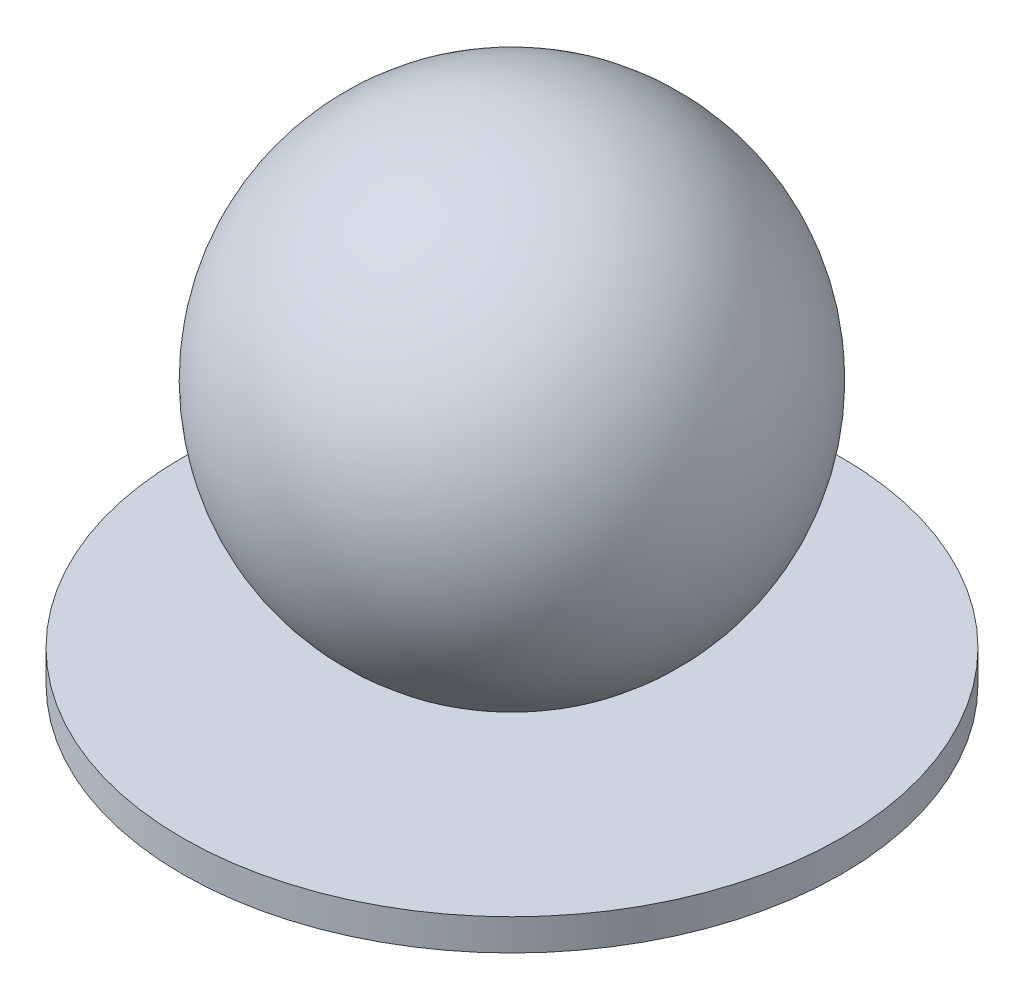
ISO-10303-21;
HEADER;
FILE_DESCRIPTION(('STEP AP214'),'2;1');
FILE_NAME('part.step','',(''),(''),'','','');
FILE_SCHEMA(('AUTOMOTIVE_DESIGN { 1 0 10303 214 1 1 1 1 }'));
ENDSEC;
DATA;
#1=APPLICATION_CONTEXT('core data for automotive mechanical design processes');
#2=APPLICATION_PROTOCOL_DEFINITION('international standard','automotive_design',2000,#1);
#3=PRODUCT_CONTEXT('',#1,'mechanical');
#4=PRODUCT('Part','Part','',(#3));
#5=PRODUCT_RELATED_PRODUCT_CATEGORY('part','',(#4));
#6=PRODUCT_DEFINITION_FORMATION('','',#4);
#7=PRODUCT_DEFINITION_CONTEXT('part definition',#1,'design');
#8=PRODUCT_DEFINITION('design','',#6,#7);
#9=PRODUCT_DEFINITION_SHAPE('','',#8);
#10=(LENGTH_UNIT() NAMED_UNIT(*) SI_UNIT(.MILLI.,.METRE.));
#11=(NAMED_UNIT(*) PLANE_ANGLE_UNIT() SI_UNIT($,.RADIAN.));
#12=(NAMED_UNIT(*) SI_UNIT($,.STERADIAN.) SOLID_ANGLE_UNIT());
#13=UNCERTAINTY_MEASURE_WITH_UNIT(LENGTH_MEASURE(1.E-05),#10,'distance_accuracy_value','');
#14=(GEOMETRIC_REPRESENTATION_CONTEXT(3) GLOBAL_UNCERTAINTY_ASSIGNED_CONTEXT((#13)) GLOBAL_UNIT_ASSIGNED_CONTEXT((#10,
#11,#12)) REPRESENTATION_CONTEXT('',''));
#15=CARTESIAN_POINT('',(0.,0.,0.));
#16=DIRECTION('',(0.,0.,1.));
#17=DIRECTION('',(1.,0.,0.));
#18=AXIS2_PLACEMENT_3D('',#15,#16,#17);
#19=CARTESIAN_POINT('',(0.,-8.4,0.));
#20=DIRECTION('',(0.,1.,0.));
#21=DIRECTION('',(0.,0.,1.));
#22=AXIS2_PLACEMENT_3D('',#19,#20,#21);
#23=CYLINDRICAL_SURFACE('',#22,10.5);
#24=CARTESIAN_POINT('',(0.,-8.4,0.));
#25=DIRECTION('',(0.,1.,0.));
#26=DIRECTION('',(0.,0.,1.));
#27=AXIS2_PLACEMENT_3D('',#24,#25,#26);
#28=CIRCLE('',#27,10.5);
#29=CARTESIAN_POINT('',(0.,-8.4,10.5));
#30=VERTEX_POINT('',#29);
#31=EDGE_CURVE('E11',#30,#30,#28,.T.);
#32=ORIENTED_EDGE('',*,*,#31,.T.);
#33=EDGE_LOOP('',(#32));
#34=FACE_BOUND('',#33,.T.);
#35=CARTESIAN_POINT('',(0.,-7.4,0.));
#36=DIRECTION('',(0.,1.,0.));
#37=DIRECTION('',(0.,0.,1.));
#38=AXIS2_PLACEMENT_3D('',#35,#36,#37);
#39=CIRCLE('',#38,10.5);
#40=CARTESIAN_POINT('',(0.,-7.4,10.5));
#41=VERTEX_POINT('',#40);
#42=EDGE_CURVE('E43',#41,#41,#39,.T.);
#43=ORIENTED_EDGE('',*,*,#42,.F.);
#44=EDGE_LOOP('',(#43));
#45=FACE_BOUND('',#44,.T.);
#46=ADVANCED_FACE('F40',(#34,#45),#23,.T.);
#47=CARTESIAN_POINT('',(0.,-8.4,0.));
#48=DIRECTION('',(0.,1.,0.));
#49=DIRECTION('',(0.,0.,1.));
#50=AXIS2_PLACEMENT_3D('',#47,#48,#49);
#51=PLANE('',#50);
#52=CARTESIAN_POINT('',(0.,-8.4,0.));
#53=DIRECTION('',(0.,-1.,0.));
#54=DIRECTION('',(0.,0.,-1.));
#55=AXIS2_PLACEMENT_3D('',#52,#53,#54);
#56=CIRCLE('',#55,0.75);
#57=CARTESIAN_POINT('',(0.,-8.4,-0.75));
#58=VERTEX_POINT('',#57);
#59=EDGE_CURVE('E52',#58,#58,#56,.T.);
#60=ORIENTED_EDGE('',*,*,#59,.F.);
#61=EDGE_LOOP('',(#60));
#62=FACE_BOUND('',#61,.T.);
#63=ORIENTED_EDGE('',*,*,#31,.F.);
#64=EDGE_LOOP('',(#63));
#65=FACE_BOUND('',#64,.T.);
#66=ADVANCED_FACE('F67',(#62,#65),#51,.F.);
#67=CARTESIAN_POINT('',(0.,-7.4,0.));
#68=DIRECTION('',(0.,1.,0.));
#69=DIRECTION('',(0.,0.,1.));
#70=AXIS2_PLACEMENT_3D('',#67,#68,#69);
#71=PLANE('',#70);
#72=ORIENTED_EDGE('',*,*,#42,.T.);
#73=EDGE_LOOP('',(#72));
#74=FACE_BOUND('',#73,.T.);
#75=ADVANCED_FACE('F63',(#74),#71,.T.);
#76=CARTESIAN_POINT('',(0.,-7.9,0.));
#77=DIRECTION('',(0.,-1.,0.));
#78=DIRECTION('',(0.,0.,-1.));
#79=AXIS2_PLACEMENT_3D('',#76,#77,#78);
#80=CYLINDRICAL_SURFACE('',#79,0.75);
#81=CARTESIAN_POINT('',(0.,-7.9,0.));
#82=DIRECTION('',(0.,-1.,0.));
#83=DIRECTION('',(0.,0.,-1.));
#84=AXIS2_PLACEMENT_3D('',#81,#82,#83);
#85=CIRCLE('',#84,0.75);
#86=CARTESIAN_POINT('',(0.,-7.9,-0.75));
#87=VERTEX_POINT('',#86);
#88=EDGE_CURVE('E50',#87,#87,#85,.T.);
#89=ORIENTED_EDGE('',*,*,#88,.F.);
#90=EDGE_LOOP('',(#89));
#91=FACE_BOUND('',#90,.T.);
#92=ORIENTED_EDGE('',*,*,#59,.T.);
#93=EDGE_LOOP('',(#92));
#94=FACE_BOUND('',#93,.T.);
#95=ADVANCED_FACE('F60',(#91,#94),#80,.F.);
#96=CARTESIAN_POINT('',(0.,-7.9,0.));
#97=DIRECTION('',(0.,-1.,0.));
#98=DIRECTION('',(0.,0.,-1.));
#99=AXIS2_PLACEMENT_3D('',#96,#97,#98);
#100=PLANE('',#99);
#101=ORIENTED_EDGE('',*,*,#88,.T.);
#102=EDGE_LOOP('',(#101));
#103=FACE_BOUND('',#102,.T.);
#104=ADVANCED_FACE('F58',(#103),#100,.T.);
#105=CLOSED_SHELL('',(#46,#66,#75,#95,#104));
#106=MANIFOLD_SOLID_BREP('B2',#105);
#107=CARTESIAN_POINT('',(0.,0.,0.));
#108=DIRECTION('',(0.,-1.,0.));
#109=DIRECTION('',(-1.,0.,0.));
#110=AXIS2_PLACEMENT_3D('',#107,#108,#109);
#111=SPHERICAL_SURFACE('',#110,7.5);
#112=CARTESIAN_POINT('',(0.,-7.5,0.));
#113=VERTEX_POINT('',#112);
#114=VERTEX_LOOP('',#113);
#115=FACE_BOUND('',#114,.T.);
#116=ADVANCED_FACE('F110',(#115),#111,.T.);
#117=CLOSED_SHELL('',(#116));
#118=MANIFOLD_SOLID_BREP('B6',#117);
#119=ADVANCED_BREP_SHAPE_REPRESENTATION('',(#18,#106,#118),#14);
#120=SHAPE_DEFINITION_REPRESENTATION(#9,#119);
ENDSEC;
END-ISO-10303-21;
